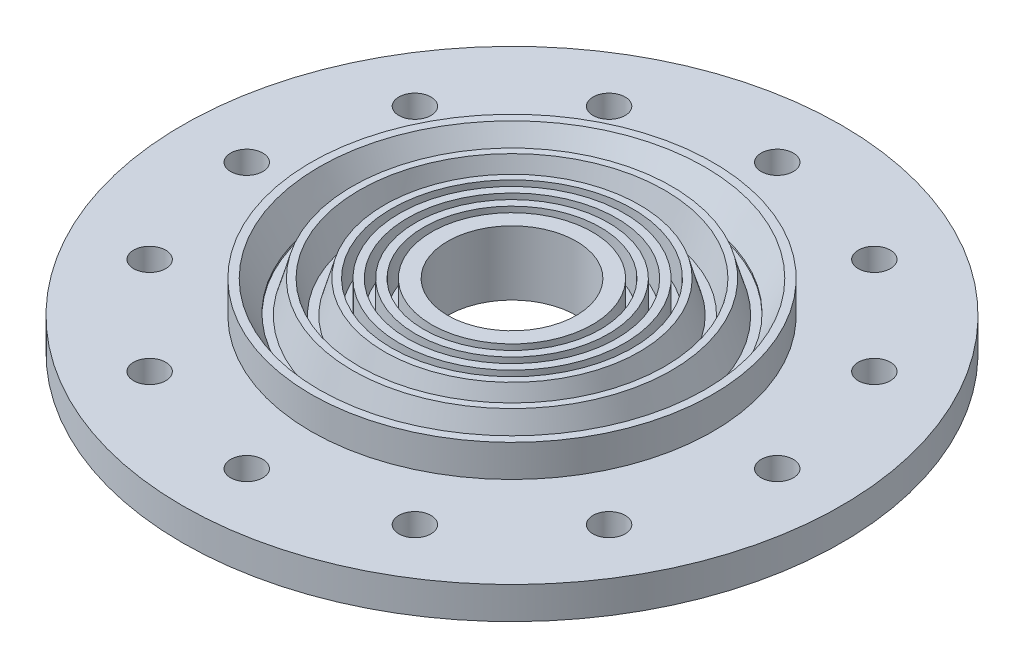
ISO-10303-21;
HEADER;
FILE_DESCRIPTION(('STEP AP214'),'2;1');
FILE_NAME('part.step','',(''),(''),'','','');
FILE_SCHEMA(('AUTOMOTIVE_DESIGN { 1 0 10303 214 1 1 1 1 }'));
ENDSEC;
DATA;
#1=APPLICATION_CONTEXT('core data for automotive mechanical design processes');
#2=APPLICATION_PROTOCOL_DEFINITION('international standard','automotive_design',2000,#1);
#3=PRODUCT_CONTEXT('',#1,'mechanical');
#4=PRODUCT('Part','Part','',(#3));
#5=PRODUCT_RELATED_PRODUCT_CATEGORY('part','',(#4));
#6=PRODUCT_DEFINITION_FORMATION('','',#4);
#7=PRODUCT_DEFINITION_CONTEXT('part definition',#1,'design');
#8=PRODUCT_DEFINITION('design','',#6,#7);
#9=PRODUCT_DEFINITION_SHAPE('','',#8);
#10=(LENGTH_UNIT() NAMED_UNIT(*) SI_UNIT(.MILLI.,.METRE.));
#11=(NAMED_UNIT(*) PLANE_ANGLE_UNIT() SI_UNIT($,.RADIAN.));
#12=(NAMED_UNIT(*) SI_UNIT($,.STERADIAN.) SOLID_ANGLE_UNIT());
#13=UNCERTAINTY_MEASURE_WITH_UNIT(LENGTH_MEASURE(1.E-05),#10,'distance_accuracy_value','');
#14=(GEOMETRIC_REPRESENTATION_CONTEXT(3) GLOBAL_UNCERTAINTY_ASSIGNED_CONTEXT((#13)) GLOBAL_UNIT_ASSIGNED_CONTEXT((#10,
#11,#12)) REPRESENTATION_CONTEXT('',''));
#15=CARTESIAN_POINT('',(0.,0.,0.));
#16=DIRECTION('',(0.,0.,1.));
#17=DIRECTION('',(1.,0.,0.));
#18=AXIS2_PLACEMENT_3D('',#15,#16,#17);
#19=CARTESIAN_POINT('',(0.,12.7,0.));
#20=DIRECTION('',(0.,-1.,0.));
#21=DIRECTION('',(0.,0.,-1.));
#22=AXIS2_PLACEMENT_3D('',#19,#20,#21);
#23=CYLINDRICAL_SURFACE('',#22,15.875);
#24=CARTESIAN_POINT('',(0.,6.35,0.));
#25=DIRECTION('',(0.,1.,0.));
#26=DIRECTION('',(0.,0.,1.));
#27=AXIS2_PLACEMENT_3D('',#24,#25,#26);
#28=CIRCLE('',#27,15.875);
#29=CARTESIAN_POINT('',(0.,6.35,15.875));
#30=VERTEX_POINT('',#29);
#31=EDGE_CURVE('E178',#30,#30,#28,.T.);
#32=ORIENTED_EDGE('',*,*,#31,.T.);
#33=EDGE_LOOP('',(#32));
#34=FACE_BOUND('',#33,.T.);
#35=CARTESIAN_POINT('',(0.,12.7,0.));
#36=DIRECTION('',(0.,1.,0.));
#37=DIRECTION('',(0.,0.,1.));
#38=AXIS2_PLACEMENT_3D('',#35,#36,#37);
#39=CIRCLE('',#38,15.875);
#40=CARTESIAN_POINT('',(0.,12.7,15.875));
#41=VERTEX_POINT('',#40);
#42=EDGE_CURVE('E172',#41,#41,#39,.T.);
#43=ORIENTED_EDGE('',*,*,#42,.F.);
#44=EDGE_LOOP('',(#43));
#45=FACE_BOUND('',#44,.T.);
#46=ADVANCED_FACE('F165',(#34,#45),#23,.T.);
#47=CARTESIAN_POINT('',(0.,12.7,0.));
#48=DIRECTION('',(0.,-1.,0.));
#49=DIRECTION('',(0.,0.,-1.));
#50=AXIS2_PLACEMENT_3D('',#47,#48,#49);
#51=CYLINDRICAL_SURFACE('',#50,12.7);
#52=CARTESIAN_POINT('',(0.,12.7,0.));
#53=DIRECTION('',(0.,1.,0.));
#54=DIRECTION('',(0.,0.,1.));
#55=AXIS2_PLACEMENT_3D('',#52,#53,#54);
#56=CIRCLE('',#55,12.7);
#57=CARTESIAN_POINT('',(0.,12.7,12.7));
#58=VERTEX_POINT('',#57);
#59=EDGE_CURVE('E11',#58,#58,#56,.T.);
#60=ORIENTED_EDGE('',*,*,#59,.T.);
#61=EDGE_LOOP('',(#60));
#62=FACE_BOUND('',#61,.T.);
#63=CARTESIAN_POINT('',(0.,0.,0.));
#64=DIRECTION('',(0.,1.,0.));
#65=DIRECTION('',(0.,0.,1.));
#66=AXIS2_PLACEMENT_3D('',#63,#64,#65);
#67=CIRCLE('',#66,12.7);
#68=CARTESIAN_POINT('',(0.,0.,12.7));
#69=VERTEX_POINT('',#68);
#70=EDGE_CURVE('E168',#69,#69,#67,.T.);
#71=ORIENTED_EDGE('',*,*,#70,.F.);
#72=EDGE_LOOP('',(#71));
#73=FACE_BOUND('',#72,.T.);
#74=ADVANCED_FACE('F341',(#62,#73),#51,.F.);
#75=CARTESIAN_POINT('',(0.,12.7,0.));
#76=DIRECTION('',(0.,1.,0.));
#77=DIRECTION('',(0.,0.,1.));
#78=AXIS2_PLACEMENT_3D('',#75,#76,#77);
#79=PLANE('',#78);
#80=ORIENTED_EDGE('',*,*,#42,.T.);
#81=EDGE_LOOP('',(#80));
#82=FACE_BOUND('',#81,.T.);
#83=ORIENTED_EDGE('',*,*,#59,.F.);
#84=EDGE_LOOP('',(#83));
#85=FACE_BOUND('',#84,.T.);
#86=ADVANCED_FACE('F346',(#82,#85),#79,.T.);
#87=CARTESIAN_POINT('',(0.,0.,0.));
#88=DIRECTION('',(0.,1.,0.));
#89=DIRECTION('',(0.,0.,1.));
#90=AXIS2_PLACEMENT_3D('',#87,#88,#89);
#91=PLANE('',#90);
#92=ORIENTED_EDGE('',*,*,#70,.T.);
#93=EDGE_LOOP('',(#92));
#94=FACE_BOUND('',#93,.T.);
#95=CARTESIAN_POINT('',(0.,0.,0.));
#96=DIRECTION('',(0.,1.,0.));
#97=DIRECTION('',(0.,0.,1.));
#98=AXIS2_PLACEMENT_3D('',#95,#96,#97);
#99=CIRCLE('',#98,65.0875);
#100=CARTESIAN_POINT('',(0.,0.,65.0875));
#101=VERTEX_POINT('',#100);
#102=EDGE_CURVE('E279',#101,#101,#99,.T.);
#103=ORIENTED_EDGE('',*,*,#102,.F.);
#104=EDGE_LOOP('',(#103));
#105=FACE_BOUND('',#104,.T.);
#106=CARTESIAN_POINT('',(45.3689058407573,0.,26.1937499999998));
#107=DIRECTION('',(0.,1.,0.));
#108=DIRECTION('',(0.,0.,1.));
#109=AXIS2_PLACEMENT_3D('',#106,#107,#108);
#110=CIRCLE('',#109,3.17500000000001);
#111=CARTESIAN_POINT('',(45.3689058407573,0.,29.3687499999998));
#112=VERTEX_POINT('',#111);
#113=EDGE_CURVE('E276',#112,#112,#110,.T.);
#114=ORIENTED_EDGE('',*,*,#113,.T.);
#115=EDGE_LOOP('',(#114));
#116=FACE_BOUND('',#115,.T.);
#117=CARTESIAN_POINT('',(26.1937500000001,0.,45.3689058407571));
#118=DIRECTION('',(0.,1.,0.));
#119=DIRECTION('',(0.,0.,1.));
#120=AXIS2_PLACEMENT_3D('',#117,#118,#119);
#121=CIRCLE('',#120,3.17500000000005);
#122=CARTESIAN_POINT('',(26.1937500000001,0.,48.5439058407572));
#123=VERTEX_POINT('',#122);
#124=EDGE_CURVE('E273',#123,#123,#121,.T.);
#125=ORIENTED_EDGE('',*,*,#124,.T.);
#126=EDGE_LOOP('',(#125));
#127=FACE_BOUND('',#126,.T.);
#128=CARTESIAN_POINT('',(2.36262003950019E-13,0.,52.3874999999999));
#129=DIRECTION('',(0.,1.,0.));
#130=DIRECTION('',(0.,0.,1.));
#131=AXIS2_PLACEMENT_3D('',#128,#129,#130);
#132=CIRCLE('',#131,3.17500000000013);
#133=CARTESIAN_POINT('',(2.36262003950019E-13,0.,55.5625000000001));
#134=VERTEX_POINT('',#133);
#135=EDGE_CURVE('E270',#134,#134,#132,.T.);
#136=ORIENTED_EDGE('',*,*,#135,.T.);
#137=EDGE_LOOP('',(#136));
#138=FACE_BOUND('',#137,.T.);
#139=CARTESIAN_POINT('',(-26.1937499999998,0.,45.3689058407573));
#140=DIRECTION('',(0.,1.,0.));
#141=DIRECTION('',(0.,0.,1.));
#142=AXIS2_PLACEMENT_3D('',#139,#140,#141);
#143=CIRCLE('',#142,3.17500000000014);
#144=CARTESIAN_POINT('',(-26.1937499999998,0.,48.5439058407575));
#145=VERTEX_POINT('',#144);
#146=EDGE_CURVE('E267',#145,#145,#143,.T.);
#147=ORIENTED_EDGE('',*,*,#146,.T.);
#148=EDGE_LOOP('',(#147));
#149=FACE_BOUND('',#148,.T.);
#150=CARTESIAN_POINT('',(-45.3689058407571,0.,26.1937500000001));
#151=DIRECTION('',(0.,1.,0.));
#152=DIRECTION('',(0.,0.,1.));
#153=AXIS2_PLACEMENT_3D('',#150,#151,#152);
#154=CIRCLE('',#153,3.17500000000009);
#155=CARTESIAN_POINT('',(-45.3689058407571,0.,29.3687500000002));
#156=VERTEX_POINT('',#155);
#157=EDGE_CURVE('E264',#156,#156,#154,.T.);
#158=ORIENTED_EDGE('',*,*,#157,.T.);
#159=EDGE_LOOP('',(#158));
#160=FACE_BOUND('',#159,.T.);
#161=CARTESIAN_POINT('',(-52.3874999999999,0.,2.08166817117217E-13));
#162=DIRECTION('',(0.,1.,0.));
#163=DIRECTION('',(0.,0.,1.));
#164=AXIS2_PLACEMENT_3D('',#161,#162,#163);
#165=CIRCLE('',#164,3.17499999999999);
#166=CARTESIAN_POINT('',(-52.3874999999999,0.,3.1750000000002));
#167=VERTEX_POINT('',#166);
#168=EDGE_CURVE('E261',#167,#167,#165,.T.);
#169=ORIENTED_EDGE('',*,*,#168,.T.);
#170=EDGE_LOOP('',(#169));
#171=FACE_BOUND('',#170,.T.);
#172=CARTESIAN_POINT('',(-45.3689058407573,0.,-26.1937499999998));
#173=DIRECTION('',(0.,1.,0.));
#174=DIRECTION('',(0.,0.,1.));
#175=AXIS2_PLACEMENT_3D('',#172,#173,#174);
#176=CIRCLE('',#175,3.1749999999998);
#177=CARTESIAN_POINT('',(-45.3689058407573,0.,-23.01875));
#178=VERTEX_POINT('',#177);
#179=EDGE_CURVE('E258',#178,#178,#176,.T.);
#180=ORIENTED_EDGE('',*,*,#179,.T.);
#181=EDGE_LOOP('',(#180));
#182=FACE_BOUND('',#181,.T.);
#183=CARTESIAN_POINT('',(45.3689058407571,0.,-26.1937500000001));
#184=DIRECTION('',(0.,1.,0.));
#185=DIRECTION('',(0.,0.,1.));
#186=AXIS2_PLACEMENT_3D('',#183,#184,#185);
#187=CIRCLE('',#186,3.175);
#188=CARTESIAN_POINT('',(45.3689058407571,0.,-23.0187500000001));
#189=VERTEX_POINT('',#188);
#190=EDGE_CURVE('E255',#189,#189,#187,.T.);
#191=ORIENTED_EDGE('',*,*,#190,.T.);
#192=EDGE_LOOP('',(#191));
#193=FACE_BOUND('',#192,.T.);
#194=CARTESIAN_POINT('',(26.1937499999998,0.,-45.3689058407574));
#195=DIRECTION('',(0.,1.,0.));
#196=DIRECTION('',(0.,0.,1.));
#197=AXIS2_PLACEMENT_3D('',#194,#195,#196);
#198=CIRCLE('',#197,3.17499999999999);
#199=CARTESIAN_POINT('',(26.1937499999998,0.,-42.1939058407574));
#200=VERTEX_POINT('',#199);
#201=EDGE_CURVE('E252',#200,#200,#198,.T.);
#202=ORIENTED_EDGE('',*,*,#201,.T.);
#203=EDGE_LOOP('',(#202));
#204=FACE_BOUND('',#203,.T.);
#205=CARTESIAN_POINT('',(-1.80411241501588E-13,0.,-52.3875));
#206=DIRECTION('',(0.,1.,0.));
#207=DIRECTION('',(0.,0.,1.));
#208=AXIS2_PLACEMENT_3D('',#205,#206,#207);
#209=CIRCLE('',#208,3.17499999999972);
#210=CARTESIAN_POINT('',(-1.80411241501588E-13,0.,-49.2125000000002));
#211=VERTEX_POINT('',#210);
#212=EDGE_CURVE('E249',#211,#211,#209,.T.);
#213=ORIENTED_EDGE('',*,*,#212,.T.);
#214=EDGE_LOOP('',(#213));
#215=FACE_BOUND('',#214,.T.);
#216=CARTESIAN_POINT('',(-26.1937500000001,0.,-45.3689058407572));
#217=DIRECTION('',(0.,1.,0.));
#218=DIRECTION('',(0.,0.,1.));
#219=AXIS2_PLACEMENT_3D('',#216,#217,#218);
#220=CIRCLE('',#219,3.17499999999972);
#221=CARTESIAN_POINT('',(-26.1937500000001,0.,-42.1939058407574));
#222=VERTEX_POINT('',#221);
#223=EDGE_CURVE('E246',#222,#222,#220,.T.);
#224=ORIENTED_EDGE('',*,*,#223,.T.);
#225=EDGE_LOOP('',(#224));
#226=FACE_BOUND('',#225,.T.);
#227=CARTESIAN_POINT('',(52.3874999999999,0.,-2.44261355371284E-13));
#228=DIRECTION('',(0.,1.,0.));
#229=DIRECTION('',(0.,0.,1.));
#230=AXIS2_PLACEMENT_3D('',#227,#228,#229);
#231=CIRCLE('',#230,3.175);
#232=CARTESIAN_POINT('',(52.3874999999999,0.,3.17499999999975));
#233=VERTEX_POINT('',#232);
#234=EDGE_CURVE('E242',#233,#233,#231,.T.);
#235=ORIENTED_EDGE('',*,*,#234,.T.);
#236=EDGE_LOOP('',(#235));
#237=FACE_BOUND('',#236,.T.);
#238=ADVANCED_FACE('F353',(#94,#105,#116,#127,#138,#149,#160,#171,#182,#193,#204,#215,#226,
#237),#91,.F.);
#239=CARTESIAN_POINT('',(0.,6.35,0.));
#240=DIRECTION('',(0.,1.,0.));
#241=DIRECTION('',(0.,0.,1.));
#242=AXIS2_PLACEMENT_3D('',#239,#240,#241);
#243=PLANE('',#242);
#244=CARTESIAN_POINT('',(0.,6.35,0.));
#245=DIRECTION('',(0.,1.,0.));
#246=DIRECTION('',(0.,0.,1.));
#247=AXIS2_PLACEMENT_3D('',#244,#245,#246);
#248=CIRCLE('',#247,17.4625);
#249=CARTESIAN_POINT('',(0.,6.35,17.4625));
#250=VERTEX_POINT('',#249);
#251=EDGE_CURVE('E181',#250,#250,#248,.F.);
#252=ORIENTED_EDGE('',*,*,#251,.F.);
#253=EDGE_LOOP('',(#252));
#254=FACE_BOUND('',#253,.T.);
#255=ORIENTED_EDGE('',*,*,#31,.F.);
#256=EDGE_LOOP('',(#255));
#257=FACE_BOUND('',#256,.T.);
#258=ADVANCED_FACE('F358',(#254,#257),#243,.T.);
#259=CARTESIAN_POINT('',(0.,12.7,0.));
#260=DIRECTION('',(0.,-1.,0.));
#261=DIRECTION('',(0.,0.,-1.));
#262=AXIS2_PLACEMENT_3D('',#259,#260,#261);
#263=CYLINDRICAL_SURFACE('',#262,19.05);
#264=CARTESIAN_POINT('',(0.,6.35,0.));
#265=DIRECTION('',(0.,1.,0.));
#266=DIRECTION('',(0.,0.,1.));
#267=AXIS2_PLACEMENT_3D('',#264,#265,#266);
#268=CIRCLE('',#267,19.05);
#269=CARTESIAN_POINT('',(0.,6.35,19.05));
#270=VERTEX_POINT('',#269);
#271=EDGE_CURVE('E190',#270,#270,#268,.T.);
#272=ORIENTED_EDGE('',*,*,#271,.T.);
#273=EDGE_LOOP('',(#272));
#274=FACE_BOUND('',#273,.T.);
#275=CARTESIAN_POINT('',(0.,12.7,0.));
#276=DIRECTION('',(0.,1.,0.));
#277=DIRECTION('',(0.,0.,1.));
#278=AXIS2_PLACEMENT_3D('',#275,#276,#277);
#279=CIRCLE('',#278,19.05);
#280=CARTESIAN_POINT('',(0.,12.7,19.05));
#281=VERTEX_POINT('',#280);
#282=EDGE_CURVE('E187',#281,#281,#279,.T.);
#283=ORIENTED_EDGE('',*,*,#282,.F.);
#284=EDGE_LOOP('',(#283));
#285=FACE_BOUND('',#284,.T.);
#286=ADVANCED_FACE('F364',(#274,#285),#263,.T.);
#287=CARTESIAN_POINT('',(0.,12.7,0.));
#288=DIRECTION('',(0.,-1.,0.));
#289=DIRECTION('',(0.,0.,-1.));
#290=AXIS2_PLACEMENT_3D('',#287,#288,#289);
#291=CYLINDRICAL_SURFACE('',#290,17.4625);
#292=ORIENTED_EDGE('',*,*,#251,.T.);
#293=EDGE_LOOP('',(#292));
#294=FACE_BOUND('',#293,.T.);
#295=CARTESIAN_POINT('',(0.,12.7,0.));
#296=DIRECTION('',(0.,1.,0.));
#297=DIRECTION('',(0.,0.,1.));
#298=AXIS2_PLACEMENT_3D('',#295,#296,#297);
#299=CIRCLE('',#298,17.4625);
#300=CARTESIAN_POINT('',(0.,12.7,17.4625));
#301=VERTEX_POINT('',#300);
#302=EDGE_CURVE('E184',#301,#301,#299,.T.);
#303=ORIENTED_EDGE('',*,*,#302,.T.);
#304=EDGE_LOOP('',(#303));
#305=FACE_BOUND('',#304,.T.);
#306=ADVANCED_FACE('F368',(#294,#305),#291,.F.);
#307=CARTESIAN_POINT('',(0.,12.7,0.));
#308=DIRECTION('',(0.,1.,0.));
#309=DIRECTION('',(0.,0.,1.));
#310=AXIS2_PLACEMENT_3D('',#307,#308,#309);
#311=PLANE('',#310);
#312=ORIENTED_EDGE('',*,*,#282,.T.);
#313=EDGE_LOOP('',(#312));
#314=FACE_BOUND('',#313,.T.);
#315=ORIENTED_EDGE('',*,*,#302,.F.);
#316=EDGE_LOOP('',(#315));
#317=FACE_BOUND('',#316,.T.);
#318=ADVANCED_FACE('F372',(#314,#317),#311,.T.);
#319=CARTESIAN_POINT('',(0.,6.35,0.));
#320=DIRECTION('',(0.,1.,0.));
#321=DIRECTION('',(0.,0.,1.));
#322=AXIS2_PLACEMENT_3D('',#319,#320,#321);
#323=PLANE('',#322);
#324=CARTESIAN_POINT('',(0.,6.35,0.));
#325=DIRECTION('',(0.,1.,0.));
#326=DIRECTION('',(0.,0.,1.));
#327=AXIS2_PLACEMENT_3D('',#324,#325,#326);
#328=CIRCLE('',#327,20.6375);
#329=CARTESIAN_POINT('',(0.,6.35,20.6375));
#330=VERTEX_POINT('',#329);
#331=EDGE_CURVE('E193',#330,#330,#328,.F.);
#332=ORIENTED_EDGE('',*,*,#331,.F.);
#333=EDGE_LOOP('',(#332));
#334=FACE_BOUND('',#333,.T.);
#335=ORIENTED_EDGE('',*,*,#271,.F.);
#336=EDGE_LOOP('',(#335));
#337=FACE_BOUND('',#336,.T.);
#338=ADVANCED_FACE('F376',(#334,#337),#323,.T.);
#339=CARTESIAN_POINT('',(0.,12.7,0.));
#340=DIRECTION('',(0.,-1.,0.));
#341=DIRECTION('',(0.,0.,-1.));
#342=AXIS2_PLACEMENT_3D('',#339,#340,#341);
#343=CYLINDRICAL_SURFACE('',#342,22.225);
#344=CARTESIAN_POINT('',(0.,6.35,0.));
#345=DIRECTION('',(0.,1.,0.));
#346=DIRECTION('',(0.,0.,1.));
#347=AXIS2_PLACEMENT_3D('',#344,#345,#346);
#348=CIRCLE('',#347,22.225);
#349=CARTESIAN_POINT('',(0.,6.35,22.225));
#350=VERTEX_POINT('',#349);
#351=EDGE_CURVE('E282',#350,#350,#348,.T.);
#352=ORIENTED_EDGE('',*,*,#351,.T.);
#353=EDGE_LOOP('',(#352));
#354=FACE_BOUND('',#353,.T.);
#355=CARTESIAN_POINT('',(0.,12.7,0.));
#356=DIRECTION('',(0.,1.,0.));
#357=DIRECTION('',(0.,0.,1.));
#358=AXIS2_PLACEMENT_3D('',#355,#356,#357);
#359=CIRCLE('',#358,22.225);
#360=CARTESIAN_POINT('',(0.,12.7,22.225));
#361=VERTEX_POINT('',#360);
#362=EDGE_CURVE('E199',#361,#361,#359,.T.);
#363=ORIENTED_EDGE('',*,*,#362,.F.);
#364=EDGE_LOOP('',(#363));
#365=FACE_BOUND('',#364,.T.);
#366=ADVANCED_FACE('F326',(#354,#365),#343,.T.);
#367=CARTESIAN_POINT('',(0.,12.7,0.));
#368=DIRECTION('',(0.,-1.,0.));
#369=DIRECTION('',(0.,0.,-1.));
#370=AXIS2_PLACEMENT_3D('',#367,#368,#369);
#371=CYLINDRICAL_SURFACE('',#370,20.6375);
#372=ORIENTED_EDGE('',*,*,#331,.T.);
#373=EDGE_LOOP('',(#372));
#374=FACE_BOUND('',#373,.T.);
#375=CARTESIAN_POINT('',(0.,12.7,0.));
#376=DIRECTION('',(0.,1.,0.));
#377=DIRECTION('',(0.,0.,1.));
#378=AXIS2_PLACEMENT_3D('',#375,#376,#377);
#379=CIRCLE('',#378,20.6375);
#380=CARTESIAN_POINT('',(0.,12.7,20.6375));
#381=VERTEX_POINT('',#380);
#382=EDGE_CURVE('E196',#381,#381,#379,.T.);
#383=ORIENTED_EDGE('',*,*,#382,.T.);
#384=EDGE_LOOP('',(#383));
#385=FACE_BOUND('',#384,.T.);
#386=ADVANCED_FACE('F383',(#374,#385),#371,.F.);
#387=CARTESIAN_POINT('',(0.,12.7,0.));
#388=DIRECTION('',(0.,1.,0.));
#389=DIRECTION('',(0.,0.,1.));
#390=AXIS2_PLACEMENT_3D('',#387,#388,#389);
#391=PLANE('',#390);
#392=ORIENTED_EDGE('',*,*,#362,.T.);
#393=EDGE_LOOP('',(#392));
#394=FACE_BOUND('',#393,.T.);
#395=ORIENTED_EDGE('',*,*,#382,.F.);
#396=EDGE_LOOP('',(#395));
#397=FACE_BOUND('',#396,.T.);
#398=ADVANCED_FACE('F386',(#394,#397),#391,.T.);
#399=CARTESIAN_POINT('',(0.,12.7,0.));
#400=DIRECTION('',(0.,-1.,0.));
#401=DIRECTION('',(0.,0.,-1.));
#402=AXIS2_PLACEMENT_3D('',#399,#400,#401);
#403=CYLINDRICAL_SURFACE('',#402,23.8125);
#404=CARTESIAN_POINT('',(0.,6.35,0.));
#405=DIRECTION('',(0.,1.,0.));
#406=DIRECTION('',(0.,0.,1.));
#407=AXIS2_PLACEMENT_3D('',#404,#405,#406);
#408=CIRCLE('',#407,23.8125);
#409=CARTESIAN_POINT('',(0.,6.35,23.8125));
#410=VERTEX_POINT('',#409);
#411=EDGE_CURVE('E202',#410,#410,#408,.T.);
#412=ORIENTED_EDGE('',*,*,#411,.F.);
#413=EDGE_LOOP('',(#412));
#414=FACE_BOUND('',#413,.T.);
#415=CARTESIAN_POINT('',(0.,12.7,0.));
#416=DIRECTION('',(0.,1.,0.));
#417=DIRECTION('',(0.,0.,1.));
#418=AXIS2_PLACEMENT_3D('',#415,#416,#417);
#419=CIRCLE('',#418,23.8125);
#420=CARTESIAN_POINT('',(0.,12.7,23.8125));
#421=VERTEX_POINT('',#420);
#422=EDGE_CURVE('E211',#421,#421,#419,.T.);
#423=ORIENTED_EDGE('',*,*,#422,.T.);
#424=EDGE_LOOP('',(#423));
#425=FACE_BOUND('',#424,.T.);
#426=ADVANCED_FACE('F390',(#414,#425),#403,.F.);
#427=CARTESIAN_POINT('',(0.,12.7,0.));
#428=DIRECTION('',(0.,1.,0.));
#429=DIRECTION('',(0.,0.,1.));
#430=AXIS2_PLACEMENT_3D('',#427,#428,#429);
#431=PLANE('',#430);
#432=CARTESIAN_POINT('',(0.,12.7,0.));
#433=DIRECTION('',(0.,1.,0.));
#434=DIRECTION('',(0.,0.,1.));
#435=AXIS2_PLACEMENT_3D('',#432,#433,#434);
#436=CIRCLE('',#435,25.1666668004315);
#437=CARTESIAN_POINT('',(0.,12.7,25.1666668004315));
#438=VERTEX_POINT('',#437);
#439=EDGE_CURVE('E208',#438,#438,#436,.T.);
#440=ORIENTED_EDGE('',*,*,#439,.T.);
#441=EDGE_LOOP('',(#440));
#442=FACE_BOUND('',#441,.T.);
#443=ORIENTED_EDGE('',*,*,#422,.F.);
#444=EDGE_LOOP('',(#443));
#445=FACE_BOUND('',#444,.T.);
#446=ADVANCED_FACE('F396',(#442,#445),#431,.T.);
#447=CARTESIAN_POINT('',(0.,12.7,0.));
#448=DIRECTION('',(0.,-1.,0.));
#449=DIRECTION('',(0.,0.,-1.));
#450=AXIS2_PLACEMENT_3D('',#447,#448,#449);
#451=CONICAL_SURFACE('',#450,25.1666668004315,0.279252680319091);
#452=CARTESIAN_POINT('',(0.,6.34999999999989,0.));
#453=DIRECTION('',(0.,1.,0.));
#454=DIRECTION('',(0.,0.,1.));
#455=AXIS2_PLACEMENT_3D('',#452,#453,#454);
#456=CIRCLE('',#455,26.9875);
#457=CARTESIAN_POINT('',(0.,6.34999999999989,26.9875));
#458=VERTEX_POINT('',#457);
#459=EDGE_CURVE('E205',#458,#458,#456,.F.);
#460=ORIENTED_EDGE('',*,*,#459,.F.);
#461=EDGE_LOOP('',(#460));
#462=FACE_BOUND('',#461,.T.);
#463=ORIENTED_EDGE('',*,*,#439,.F.);
#464=EDGE_LOOP('',(#463));
#465=FACE_BOUND('',#464,.T.);
#466=ADVANCED_FACE('F392',(#462,#465),#451,.T.);
#467=CARTESIAN_POINT('',(0.,6.35,0.));
#468=DIRECTION('',(0.,-1.,0.));
#469=DIRECTION('',(0.,0.,-1.));
#470=AXIS2_PLACEMENT_3D('',#467,#468,#469);
#471=CYLINDRICAL_SURFACE('',#470,28.575);
#472=CARTESIAN_POINT('',(0.,6.3328852680119,0.));
#473=DIRECTION('',(0.,1.,0.));
#474=DIRECTION('',(0.,0.,1.));
#475=AXIS2_PLACEMENT_3D('',#472,#473,#474);
#476=CIRCLE('',#475,28.575);
#477=CARTESIAN_POINT('',(0.,6.3328852680119,28.575));
#478=VERTEX_POINT('',#477);
#479=EDGE_CURVE('E220',#478,#478,#476,.T.);
#480=ORIENTED_EDGE('',*,*,#479,.T.);
#481=EDGE_LOOP('',(#480));
#482=FACE_BOUND('',#481,.T.);
#483=CARTESIAN_POINT('',(0.,6.35,0.));
#484=DIRECTION('',(0.,1.,0.));
#485=DIRECTION('',(0.,0.,1.));
#486=AXIS2_PLACEMENT_3D('',#483,#484,#485);
#487=CIRCLE('',#486,28.575);
#488=CARTESIAN_POINT('',(0.,6.35,28.575));
#489=VERTEX_POINT('',#488);
#490=EDGE_CURVE('E214',#489,#489,#487,.T.);
#491=ORIENTED_EDGE('',*,*,#490,.F.);
#492=EDGE_LOOP('',(#491));
#493=FACE_BOUND('',#492,.T.);
#494=ADVANCED_FACE('F395',(#482,#493),#471,.T.);
#495=CARTESIAN_POINT('',(0.,6.35,0.));
#496=DIRECTION('',(0.,1.,0.));
#497=DIRECTION('',(0.,0.,1.));
#498=AXIS2_PLACEMENT_3D('',#495,#496,#497);
#499=PLANE('',#498);
#500=ORIENTED_EDGE('',*,*,#490,.T.);
#501=EDGE_LOOP('',(#500));
#502=FACE_BOUND('',#501,.T.);
#503=ORIENTED_EDGE('',*,*,#459,.T.);
#504=EDGE_LOOP('',(#503));
#505=FACE_BOUND('',#504,.T.);
#506=ADVANCED_FACE('F406',(#502,#505),#499,.T.);
#507=CARTESIAN_POINT('',(0.,12.7,0.));
#508=DIRECTION('',(0.,1.,0.));
#509=DIRECTION('',(0.,0.,1.));
#510=AXIS2_PLACEMENT_3D('',#507,#508,#509);
#511=PLANE('',#510);
#512=CARTESIAN_POINT('',(0.,12.7,0.));
#513=DIRECTION('',(0.,1.,0.));
#514=DIRECTION('',(0.,0.,1.));
#515=AXIS2_PLACEMENT_3D('',#512,#513,#514);
#516=CIRCLE('',#515,30.1625);
#517=CARTESIAN_POINT('',(0.,12.7,30.1625));
#518=VERTEX_POINT('',#517);
#519=EDGE_CURVE('E217',#518,#518,#516,.F.);
#520=ORIENTED_EDGE('',*,*,#519,.T.);
#521=EDGE_LOOP('',(#520));
#522=FACE_BOUND('',#521,.T.);
#523=CARTESIAN_POINT('',(0.,12.7,0.));
#524=DIRECTION('',(0.,1.,0.));
#525=DIRECTION('',(0.,0.,1.));
#526=AXIS2_PLACEMENT_3D('',#523,#524,#525);
#527=CIRCLE('',#526,31.5166668004316);
#528=CARTESIAN_POINT('',(0.,12.7,31.5166668004316));
#529=VERTEX_POINT('',#528);
#530=EDGE_CURVE('E226',#529,#529,#527,.T.);
#531=ORIENTED_EDGE('',*,*,#530,.T.);
#532=EDGE_LOOP('',(#531));
#533=FACE_BOUND('',#532,.T.);
#534=ADVANCED_FACE('F410',(#522,#533),#511,.T.);
#535=CARTESIAN_POINT('',(0.,12.7,0.));
#536=DIRECTION('',(0.,-1.,0.));
#537=DIRECTION('',(0.,0.,-1.));
#538=AXIS2_PLACEMENT_3D('',#535,#536,#537);
#539=CONICAL_SURFACE('',#538,31.5166668004316,0.27925268031909);
#540=CARTESIAN_POINT('',(0.,6.34999999999988,0.));
#541=DIRECTION('',(0.,1.,0.));
#542=DIRECTION('',(0.,0.,1.));
#543=AXIS2_PLACEMENT_3D('',#540,#541,#542);
#544=CIRCLE('',#543,33.3375);
#545=CARTESIAN_POINT('',(0.,6.34999999999988,33.3375));
#546=VERTEX_POINT('',#545);
#547=EDGE_CURVE('E223',#546,#546,#544,.F.);
#548=ORIENTED_EDGE('',*,*,#547,.F.);
#549=EDGE_LOOP('',(#548));
#550=FACE_BOUND('',#549,.T.);
#551=ORIENTED_EDGE('',*,*,#530,.F.);
#552=EDGE_LOOP('',(#551));
#553=FACE_BOUND('',#552,.T.);
#554=ADVANCED_FACE('F416',(#550,#553),#539,.T.);
#555=CARTESIAN_POINT('',(0.,6.3328852680119,0.));
#556=DIRECTION('',(0.,1.,0.));
#557=DIRECTION('',(0.,0.,1.));
#558=AXIS2_PLACEMENT_3D('',#555,#556,#557);
#559=CONICAL_SURFACE('',#558,28.575,0.244346095279207);
#560=ORIENTED_EDGE('',*,*,#519,.F.);
#561=EDGE_LOOP('',(#560));
#562=FACE_BOUND('',#561,.T.);
#563=ORIENTED_EDGE('',*,*,#479,.F.);
#564=EDGE_LOOP('',(#563));
#565=FACE_BOUND('',#564,.T.);
#566=ADVANCED_FACE('F412',(#562,#565),#559,.F.);
#567=CARTESIAN_POINT('',(0.,6.35,0.));
#568=DIRECTION('',(0.,1.,0.));
#569=DIRECTION('',(0.,0.,1.));
#570=AXIS2_PLACEMENT_3D('',#567,#568,#569);
#571=PLANE('',#570);
#572=CARTESIAN_POINT('',(0.,6.35,0.));
#573=DIRECTION('',(0.,1.,0.));
#574=DIRECTION('',(0.,0.,1.));
#575=AXIS2_PLACEMENT_3D('',#572,#573,#574);
#576=CIRCLE('',#575,34.925);
#577=CARTESIAN_POINT('',(0.,6.35,34.925));
#578=VERTEX_POINT('',#577);
#579=EDGE_CURVE('E229',#578,#578,#576,.F.);
#580=ORIENTED_EDGE('',*,*,#579,.F.);
#581=EDGE_LOOP('',(#580));
#582=FACE_BOUND('',#581,.T.);
#583=ORIENTED_EDGE('',*,*,#547,.T.);
#584=EDGE_LOOP('',(#583));
#585=FACE_BOUND('',#584,.T.);
#586=ADVANCED_FACE('F415',(#582,#585),#571,.T.);
#587=CARTESIAN_POINT('',(0.,12.7,0.));
#588=DIRECTION('',(0.,-1.,0.));
#589=DIRECTION('',(0.,0.,-1.));
#590=AXIS2_PLACEMENT_3D('',#587,#588,#589);
#591=CYLINDRICAL_SURFACE('',#590,39.6875);
#592=CARTESIAN_POINT('',(0.,6.35,0.));
#593=DIRECTION('',(0.,1.,0.));
#594=DIRECTION('',(0.,0.,1.));
#595=AXIS2_PLACEMENT_3D('',#592,#593,#594);
#596=CIRCLE('',#595,39.6875);
#597=CARTESIAN_POINT('',(0.,6.35,39.6875));
#598=VERTEX_POINT('',#597);
#599=EDGE_CURVE('E285',#598,#598,#596,.T.);
#600=ORIENTED_EDGE('',*,*,#599,.T.);
#601=EDGE_LOOP('',(#600));
#602=FACE_BOUND('',#601,.T.);
#603=CARTESIAN_POINT('',(0.,12.7,0.));
#604=DIRECTION('',(0.,1.,0.));
#605=DIRECTION('',(0.,0.,1.));
#606=AXIS2_PLACEMENT_3D('',#603,#604,#605);
#607=CIRCLE('',#606,39.6875);
#608=CARTESIAN_POINT('',(0.,12.7,39.6875));
#609=VERTEX_POINT('',#608);
#610=EDGE_CURVE('E238',#609,#609,#607,.T.);
#611=ORIENTED_EDGE('',*,*,#610,.F.);
#612=EDGE_LOOP('',(#611));
#613=FACE_BOUND('',#612,.T.);
#614=ADVANCED_FACE('F426',(#602,#613),#591,.T.);
#615=CARTESIAN_POINT('',(0.,12.7,0.));
#616=DIRECTION('',(0.,-1.,0.));
#617=DIRECTION('',(0.,0.,-1.));
#618=AXIS2_PLACEMENT_3D('',#615,#616,#617);
#619=CYLINDRICAL_SURFACE('',#618,34.925);
#620=ORIENTED_EDGE('',*,*,#579,.T.);
#621=EDGE_LOOP('',(#620));
#622=FACE_BOUND('',#621,.T.);
#623=CARTESIAN_POINT('',(0.,6.72869347252541,0.));
#624=DIRECTION('',(0.,1.,0.));
#625=DIRECTION('',(0.,0.,1.));
#626=AXIS2_PLACEMENT_3D('',#623,#624,#625);
#627=CIRCLE('',#626,34.925);
#628=CARTESIAN_POINT('',(0.,6.72869347252541,34.925));
#629=VERTEX_POINT('',#628);
#630=EDGE_CURVE('E235',#629,#629,#627,.T.);
#631=ORIENTED_EDGE('',*,*,#630,.T.);
#632=EDGE_LOOP('',(#631));
#633=FACE_BOUND('',#632,.T.);
#634=ADVANCED_FACE('F436',(#622,#633),#619,.F.);
#635=CARTESIAN_POINT('',(0.,12.7,0.));
#636=DIRECTION('',(0.,1.,0.));
#637=DIRECTION('',(0.,0.,1.));
#638=AXIS2_PLACEMENT_3D('',#635,#636,#637);
#639=PLANE('',#638);
#640=CARTESIAN_POINT('',(0.,12.7,0.));
#641=DIRECTION('',(0.,1.,0.));
#642=DIRECTION('',(0.,0.,1.));
#643=AXIS2_PLACEMENT_3D('',#640,#641,#642);
#644=CIRCLE('',#643,38.1);
#645=CARTESIAN_POINT('',(0.,12.7,38.1));
#646=VERTEX_POINT('',#645);
#647=EDGE_CURVE('E232',#646,#646,#644,.F.);
#648=ORIENTED_EDGE('',*,*,#647,.T.);
#649=EDGE_LOOP('',(#648));
#650=FACE_BOUND('',#649,.T.);
#651=ORIENTED_EDGE('',*,*,#610,.T.);
#652=EDGE_LOOP('',(#651));
#653=FACE_BOUND('',#652,.T.);
#654=ADVANCED_FACE('F432',(#650,#653),#639,.T.);
#655=CARTESIAN_POINT('',(0.,6.72869347252541,0.));
#656=DIRECTION('',(0.,1.,0.));
#657=DIRECTION('',(0.,0.,1.));
#658=AXIS2_PLACEMENT_3D('',#655,#656,#657);
#659=CONICAL_SURFACE('',#658,34.925,0.488692190558413);
#660=ORIENTED_EDGE('',*,*,#647,.F.);
#661=EDGE_LOOP('',(#660));
#662=FACE_BOUND('',#661,.T.);
#663=ORIENTED_EDGE('',*,*,#630,.F.);
#664=EDGE_LOOP('',(#663));
#665=FACE_BOUND('',#664,.T.);
#666=ADVANCED_FACE('F428',(#662,#665),#659,.F.);
#667=CARTESIAN_POINT('',(-26.1937500000001,6.35,-45.3689058407572));
#668=DIRECTION('',(0.,-1.,0.));
#669=DIRECTION('',(0.,0.,-1.));
#670=AXIS2_PLACEMENT_3D('',#667,#668,#669);
#671=CYLINDRICAL_SURFACE('',#670,3.17499999999972);
#672=CARTESIAN_POINT('',(-26.1937500000001,6.35,-45.3689058407572));
#673=DIRECTION('',(0.,1.,0.));
#674=DIRECTION('',(0.,0.,1.));
#675=AXIS2_PLACEMENT_3D('',#672,#673,#674);
#676=CIRCLE('',#675,3.17499999999972);
#677=CARTESIAN_POINT('',(-26.1937500000001,6.35,-42.1939058407574));
#678=VERTEX_POINT('',#677);
#679=EDGE_CURVE('E288',#678,#678,#676,.T.);
#680=ORIENTED_EDGE('',*,*,#679,.T.);
#681=EDGE_LOOP('',(#680));
#682=FACE_BOUND('',#681,.T.);
#683=ORIENTED_EDGE('',*,*,#223,.F.);
#684=EDGE_LOOP('',(#683));
#685=FACE_BOUND('',#684,.T.);
#686=ADVANCED_FACE('F431',(#682,#685),#671,.F.);
#687=CARTESIAN_POINT('',(-1.80411241501588E-13,6.35,-52.3875));
#688=DIRECTION('',(0.,-1.,0.));
#689=DIRECTION('',(0.,0.,-1.));
#690=AXIS2_PLACEMENT_3D('',#687,#688,#689);
#691=CYLINDRICAL_SURFACE('',#690,3.17499999999972);
#692=CARTESIAN_POINT('',(-1.80411241501588E-13,6.35,-52.3875));
#693=DIRECTION('',(0.,1.,0.));
#694=DIRECTION('',(0.,0.,1.));
#695=AXIS2_PLACEMENT_3D('',#692,#693,#694);
#696=CIRCLE('',#695,3.17499999999972);
#697=CARTESIAN_POINT('',(-1.80411241501588E-13,6.35,-49.2125000000002));
#698=VERTEX_POINT('',#697);
#699=EDGE_CURVE('E291',#698,#698,#696,.T.);
#700=ORIENTED_EDGE('',*,*,#699,.T.);
#701=EDGE_LOOP('',(#700));
#702=FACE_BOUND('',#701,.T.);
#703=ORIENTED_EDGE('',*,*,#212,.F.);
#704=EDGE_LOOP('',(#703));
#705=FACE_BOUND('',#704,.T.);
#706=ADVANCED_FACE('F483',(#702,#705),#691,.F.);
#707=CARTESIAN_POINT('',(26.1937499999998,6.35,-45.3689058407574));
#708=DIRECTION('',(0.,-1.,0.));
#709=DIRECTION('',(0.,0.,-1.));
#710=AXIS2_PLACEMENT_3D('',#707,#708,#709);
#711=CYLINDRICAL_SURFACE('',#710,3.17499999999999);
#712=CARTESIAN_POINT('',(26.1937499999998,6.35,-45.3689058407574));
#713=DIRECTION('',(0.,1.,0.));
#714=DIRECTION('',(0.,0.,1.));
#715=AXIS2_PLACEMENT_3D('',#712,#713,#714);
#716=CIRCLE('',#715,3.17499999999999);
#717=CARTESIAN_POINT('',(26.1937499999998,6.35,-42.1939058407574));
#718=VERTEX_POINT('',#717);
#719=EDGE_CURVE('E294',#718,#718,#716,.T.);
#720=ORIENTED_EDGE('',*,*,#719,.T.);
#721=EDGE_LOOP('',(#720));
#722=FACE_BOUND('',#721,.T.);
#723=ORIENTED_EDGE('',*,*,#201,.F.);
#724=EDGE_LOOP('',(#723));
#725=FACE_BOUND('',#724,.T.);
#726=ADVANCED_FACE('F479',(#722,#725),#711,.F.);
#727=CARTESIAN_POINT('',(45.3689058407571,6.35,-26.1937500000001));
#728=DIRECTION('',(0.,-1.,0.));
#729=DIRECTION('',(0.,0.,-1.));
#730=AXIS2_PLACEMENT_3D('',#727,#728,#729);
#731=CYLINDRICAL_SURFACE('',#730,3.175);
#732=CARTESIAN_POINT('',(45.3689058407571,6.35,-26.1937500000001));
#733=DIRECTION('',(0.,1.,0.));
#734=DIRECTION('',(0.,0.,1.));
#735=AXIS2_PLACEMENT_3D('',#732,#733,#734);
#736=CIRCLE('',#735,3.175);
#737=CARTESIAN_POINT('',(45.3689058407571,6.35,-23.0187500000001));
#738=VERTEX_POINT('',#737);
#739=EDGE_CURVE('E297',#738,#738,#736,.T.);
#740=ORIENTED_EDGE('',*,*,#739,.T.);
#741=EDGE_LOOP('',(#740));
#742=FACE_BOUND('',#741,.T.);
#743=ORIENTED_EDGE('',*,*,#190,.F.);
#744=EDGE_LOOP('',(#743));
#745=FACE_BOUND('',#744,.T.);
#746=ADVANCED_FACE('F475',(#742,#745),#731,.F.);
#747=CARTESIAN_POINT('',(-45.3689058407573,6.35,-26.1937499999998));
#748=DIRECTION('',(0.,-1.,0.));
#749=DIRECTION('',(0.,0.,-1.));
#750=AXIS2_PLACEMENT_3D('',#747,#748,#749);
#751=CYLINDRICAL_SURFACE('',#750,3.1749999999998);
#752=CARTESIAN_POINT('',(-45.3689058407573,6.35,-26.1937499999998));
#753=DIRECTION('',(0.,1.,0.));
#754=DIRECTION('',(0.,0.,1.));
#755=AXIS2_PLACEMENT_3D('',#752,#753,#754);
#756=CIRCLE('',#755,3.1749999999998);
#757=CARTESIAN_POINT('',(-45.3689058407573,6.35,-23.01875));
#758=VERTEX_POINT('',#757);
#759=EDGE_CURVE('E300',#758,#758,#756,.T.);
#760=ORIENTED_EDGE('',*,*,#759,.T.);
#761=EDGE_LOOP('',(#760));
#762=FACE_BOUND('',#761,.T.);
#763=ORIENTED_EDGE('',*,*,#179,.F.);
#764=EDGE_LOOP('',(#763));
#765=FACE_BOUND('',#764,.T.);
#766=ADVANCED_FACE('F471',(#762,#765),#751,.F.);
#767=CARTESIAN_POINT('',(-52.3874999999999,6.35,2.08166817117217E-13));
#768=DIRECTION('',(0.,-1.,0.));
#769=DIRECTION('',(0.,0.,-1.));
#770=AXIS2_PLACEMENT_3D('',#767,#768,#769);
#771=CYLINDRICAL_SURFACE('',#770,3.17499999999999);
#772=CARTESIAN_POINT('',(-52.3874999999999,6.35,2.08166817117217E-13));
#773=DIRECTION('',(0.,1.,0.));
#774=DIRECTION('',(0.,0.,1.));
#775=AXIS2_PLACEMENT_3D('',#772,#773,#774);
#776=CIRCLE('',#775,3.17499999999999);
#777=CARTESIAN_POINT('',(-52.3874999999999,6.35,3.1750000000002));
#778=VERTEX_POINT('',#777);
#779=EDGE_CURVE('E303',#778,#778,#776,.T.);
#780=ORIENTED_EDGE('',*,*,#779,.T.);
#781=EDGE_LOOP('',(#780));
#782=FACE_BOUND('',#781,.T.);
#783=ORIENTED_EDGE('',*,*,#168,.F.);
#784=EDGE_LOOP('',(#783));
#785=FACE_BOUND('',#784,.T.);
#786=ADVANCED_FACE('F467',(#782,#785),#771,.F.);
#787=CARTESIAN_POINT('',(-45.3689058407571,6.35,26.1937500000001));
#788=DIRECTION('',(0.,-1.,0.));
#789=DIRECTION('',(0.,0.,-1.));
#790=AXIS2_PLACEMENT_3D('',#787,#788,#789);
#791=CYLINDRICAL_SURFACE('',#790,3.17500000000009);
#792=CARTESIAN_POINT('',(-45.3689058407571,6.35,26.1937500000001));
#793=DIRECTION('',(0.,1.,0.));
#794=DIRECTION('',(0.,0.,1.));
#795=AXIS2_PLACEMENT_3D('',#792,#793,#794);
#796=CIRCLE('',#795,3.17500000000009);
#797=CARTESIAN_POINT('',(-45.3689058407571,6.35,29.3687500000002));
#798=VERTEX_POINT('',#797);
#799=EDGE_CURVE('E306',#798,#798,#796,.T.);
#800=ORIENTED_EDGE('',*,*,#799,.T.);
#801=EDGE_LOOP('',(#800));
#802=FACE_BOUND('',#801,.T.);
#803=ORIENTED_EDGE('',*,*,#157,.F.);
#804=EDGE_LOOP('',(#803));
#805=FACE_BOUND('',#804,.T.);
#806=ADVANCED_FACE('F463',(#802,#805),#791,.F.);
#807=CARTESIAN_POINT('',(-26.1937499999998,6.35,45.3689058407573));
#808=DIRECTION('',(0.,-1.,0.));
#809=DIRECTION('',(0.,0.,-1.));
#810=AXIS2_PLACEMENT_3D('',#807,#808,#809);
#811=CYLINDRICAL_SURFACE('',#810,3.17500000000014);
#812=CARTESIAN_POINT('',(-26.1937499999998,6.35,45.3689058407573));
#813=DIRECTION('',(0.,1.,0.));
#814=DIRECTION('',(0.,0.,1.));
#815=AXIS2_PLACEMENT_3D('',#812,#813,#814);
#816=CIRCLE('',#815,3.17500000000014);
#817=CARTESIAN_POINT('',(-26.1937499999998,6.35,48.5439058407575));
#818=VERTEX_POINT('',#817);
#819=EDGE_CURVE('E309',#818,#818,#816,.T.);
#820=ORIENTED_EDGE('',*,*,#819,.T.);
#821=EDGE_LOOP('',(#820));
#822=FACE_BOUND('',#821,.T.);
#823=ORIENTED_EDGE('',*,*,#146,.F.);
#824=EDGE_LOOP('',(#823));
#825=FACE_BOUND('',#824,.T.);
#826=ADVANCED_FACE('F459',(#822,#825),#811,.F.);
#827=CARTESIAN_POINT('',(2.36262003950019E-13,6.35,52.3874999999999));
#828=DIRECTION('',(0.,-1.,0.));
#829=DIRECTION('',(0.,0.,-1.));
#830=AXIS2_PLACEMENT_3D('',#827,#828,#829);
#831=CYLINDRICAL_SURFACE('',#830,3.17500000000013);
#832=CARTESIAN_POINT('',(2.36262003950019E-13,6.35,52.3874999999999));
#833=DIRECTION('',(0.,1.,0.));
#834=DIRECTION('',(0.,0.,1.));
#835=AXIS2_PLACEMENT_3D('',#832,#833,#834);
#836=CIRCLE('',#835,3.17500000000013);
#837=CARTESIAN_POINT('',(2.36262003950019E-13,6.35,55.5625000000001));
#838=VERTEX_POINT('',#837);
#839=EDGE_CURVE('E312',#838,#838,#836,.T.);
#840=ORIENTED_EDGE('',*,*,#839,.T.);
#841=EDGE_LOOP('',(#840));
#842=FACE_BOUND('',#841,.T.);
#843=ORIENTED_EDGE('',*,*,#135,.F.);
#844=EDGE_LOOP('',(#843));
#845=FACE_BOUND('',#844,.T.);
#846=ADVANCED_FACE('F455',(#842,#845),#831,.F.);
#847=CARTESIAN_POINT('',(26.1937500000001,6.35,45.3689058407571));
#848=DIRECTION('',(0.,-1.,0.));
#849=DIRECTION('',(0.,0.,-1.));
#850=AXIS2_PLACEMENT_3D('',#847,#848,#849);
#851=CYLINDRICAL_SURFACE('',#850,3.17500000000005);
#852=CARTESIAN_POINT('',(26.1937500000001,6.35,45.3689058407571));
#853=DIRECTION('',(0.,1.,0.));
#854=DIRECTION('',(0.,0.,1.));
#855=AXIS2_PLACEMENT_3D('',#852,#853,#854);
#856=CIRCLE('',#855,3.17500000000005);
#857=CARTESIAN_POINT('',(26.1937500000001,6.35,48.5439058407572));
#858=VERTEX_POINT('',#857);
#859=EDGE_CURVE('E315',#858,#858,#856,.T.);
#860=ORIENTED_EDGE('',*,*,#859,.T.);
#861=EDGE_LOOP('',(#860));
#862=FACE_BOUND('',#861,.T.);
#863=ORIENTED_EDGE('',*,*,#124,.F.);
#864=EDGE_LOOP('',(#863));
#865=FACE_BOUND('',#864,.T.);
#866=ADVANCED_FACE('F451',(#862,#865),#851,.F.);
#867=CARTESIAN_POINT('',(45.3689058407573,6.35,26.1937499999998));
#868=DIRECTION('',(0.,-1.,0.));
#869=DIRECTION('',(0.,0.,-1.));
#870=AXIS2_PLACEMENT_3D('',#867,#868,#869);
#871=CYLINDRICAL_SURFACE('',#870,3.17500000000001);
#872=CARTESIAN_POINT('',(45.3689058407573,6.35,26.1937499999998));
#873=DIRECTION('',(0.,1.,0.));
#874=DIRECTION('',(0.,0.,1.));
#875=AXIS2_PLACEMENT_3D('',#872,#873,#874);
#876=CIRCLE('',#875,3.17500000000001);
#877=CARTESIAN_POINT('',(45.3689058407573,6.35,29.3687499999998));
#878=VERTEX_POINT('',#877);
#879=EDGE_CURVE('E318',#878,#878,#876,.T.);
#880=ORIENTED_EDGE('',*,*,#879,.T.);
#881=EDGE_LOOP('',(#880));
#882=FACE_BOUND('',#881,.T.);
#883=ORIENTED_EDGE('',*,*,#113,.F.);
#884=EDGE_LOOP('',(#883));
#885=FACE_BOUND('',#884,.T.);
#886=ADVANCED_FACE('F447',(#882,#885),#871,.F.);
#887=CARTESIAN_POINT('',(0.,6.35,0.));
#888=DIRECTION('',(0.,-1.,0.));
#889=DIRECTION('',(0.,0.,-1.));
#890=AXIS2_PLACEMENT_3D('',#887,#888,#889);
#891=CYLINDRICAL_SURFACE('',#890,65.0875);
#892=CARTESIAN_POINT('',(0.,6.35,0.));
#893=DIRECTION('',(0.,1.,0.));
#894=DIRECTION('',(0.,0.,1.));
#895=AXIS2_PLACEMENT_3D('',#892,#893,#894);
#896=CIRCLE('',#895,65.0875);
#897=CARTESIAN_POINT('',(0.,6.35,65.0875));
#898=VERTEX_POINT('',#897);
#899=EDGE_CURVE('E245',#898,#898,#896,.T.);
#900=ORIENTED_EDGE('',*,*,#899,.F.);
#901=EDGE_LOOP('',(#900));
#902=FACE_BOUND('',#901,.T.);
#903=ORIENTED_EDGE('',*,*,#102,.T.);
#904=EDGE_LOOP('',(#903));
#905=FACE_BOUND('',#904,.T.);
#906=ADVANCED_FACE('F444',(#902,#905),#891,.T.);
#907=CARTESIAN_POINT('',(52.3874999999999,6.35,-2.44261355371284E-13));
#908=DIRECTION('',(0.,-1.,0.));
#909=DIRECTION('',(0.,0.,-1.));
#910=AXIS2_PLACEMENT_3D('',#907,#908,#909);
#911=CYLINDRICAL_SURFACE('',#910,3.175);
#912=CARTESIAN_POINT('',(52.3874999999999,6.35,-2.44261355371284E-13));
#913=DIRECTION('',(0.,1.,0.));
#914=DIRECTION('',(0.,0.,1.));
#915=AXIS2_PLACEMENT_3D('',#912,#913,#914);
#916=CIRCLE('',#915,3.175);
#917=CARTESIAN_POINT('',(52.3874999999999,6.35,3.17499999999975));
#918=VERTEX_POINT('',#917);
#919=EDGE_CURVE('E241',#918,#918,#916,.T.);
#920=ORIENTED_EDGE('',*,*,#919,.T.);
#921=EDGE_LOOP('',(#920));
#922=FACE_BOUND('',#921,.T.);
#923=ORIENTED_EDGE('',*,*,#234,.F.);
#924=EDGE_LOOP('',(#923));
#925=FACE_BOUND('',#924,.T.);
#926=ADVANCED_FACE('F337',(#922,#925),#911,.F.);
#927=CARTESIAN_POINT('',(0.,6.35,0.));
#928=DIRECTION('',(0.,1.,0.));
#929=DIRECTION('',(0.,0.,1.));
#930=AXIS2_PLACEMENT_3D('',#927,#928,#929);
#931=PLANE('',#930);
#932=ORIENTED_EDGE('',*,*,#899,.T.);
#933=EDGE_LOOP('',(#932));
#934=FACE_BOUND('',#933,.T.);
#935=ORIENTED_EDGE('',*,*,#879,.F.);
#936=EDGE_LOOP('',(#935));
#937=FACE_BOUND('',#936,.T.);
#938=ORIENTED_EDGE('',*,*,#859,.F.);
#939=EDGE_LOOP('',(#938));
#940=FACE_BOUND('',#939,.T.);
#941=ORIENTED_EDGE('',*,*,#839,.F.);
#942=EDGE_LOOP('',(#941));
#943=FACE_BOUND('',#942,.T.);
#944=ORIENTED_EDGE('',*,*,#819,.F.);
#945=EDGE_LOOP('',(#944));
#946=FACE_BOUND('',#945,.T.);
#947=ORIENTED_EDGE('',*,*,#799,.F.);
#948=EDGE_LOOP('',(#947));
#949=FACE_BOUND('',#948,.T.);
#950=ORIENTED_EDGE('',*,*,#779,.F.);
#951=EDGE_LOOP('',(#950));
#952=FACE_BOUND('',#951,.T.);
#953=ORIENTED_EDGE('',*,*,#759,.F.);
#954=EDGE_LOOP('',(#953));
#955=FACE_BOUND('',#954,.T.);
#956=ORIENTED_EDGE('',*,*,#739,.F.);
#957=EDGE_LOOP('',(#956));
#958=FACE_BOUND('',#957,.T.);
#959=ORIENTED_EDGE('',*,*,#719,.F.);
#960=EDGE_LOOP('',(#959));
#961=FACE_BOUND('',#960,.T.);
#962=ORIENTED_EDGE('',*,*,#699,.F.);
#963=EDGE_LOOP('',(#962));
#964=FACE_BOUND('',#963,.T.);
#965=ORIENTED_EDGE('',*,*,#679,.F.);
#966=EDGE_LOOP('',(#965));
#967=FACE_BOUND('',#966,.T.);
#968=ORIENTED_EDGE('',*,*,#599,.F.);
#969=EDGE_LOOP('',(#968));
#970=FACE_BOUND('',#969,.T.);
#971=ORIENTED_EDGE('',*,*,#919,.F.);
#972=EDGE_LOOP('',(#971));
#973=FACE_BOUND('',#972,.T.);
#974=ADVANCED_FACE('F331',(#934,#937,#940,#943,#946,#949,#952,#955,#958,#961,#964,#967,#970,
#973),#931,.T.);
#975=CARTESIAN_POINT('',(0.,6.35,0.));
#976=DIRECTION('',(0.,1.,0.));
#977=DIRECTION('',(0.,0.,1.));
#978=AXIS2_PLACEMENT_3D('',#975,#976,#977);
#979=PLANE('',#978);
#980=ORIENTED_EDGE('',*,*,#411,.T.);
#981=EDGE_LOOP('',(#980));
#982=FACE_BOUND('',#981,.T.);
#983=ORIENTED_EDGE('',*,*,#351,.F.);
#984=EDGE_LOOP('',(#983));
#985=FACE_BOUND('',#984,.T.);
#986=ADVANCED_FACE('F329',(#982,#985),#979,.T.);
#987=CLOSED_SHELL('',(#46,#74,#86,#238,#258,#286,#306,#318,#338,#366,#386,#398,#426,#446,#466,
#494,#506,#534,#554,#566,#586,#614,#634,#654,#666,#686,#706,#726,#746,#766,#786,#806,#826,#846,
#866,#886,#906,#926,#974,#986));
#988=MANIFOLD_SOLID_BREP('B2',#987);
#989=ADVANCED_BREP_SHAPE_REPRESENTATION('',(#18,#988),#14);
#990=SHAPE_DEFINITION_REPRESENTATION(#9,#989);
ENDSEC;
END-ISO-10303-21;
